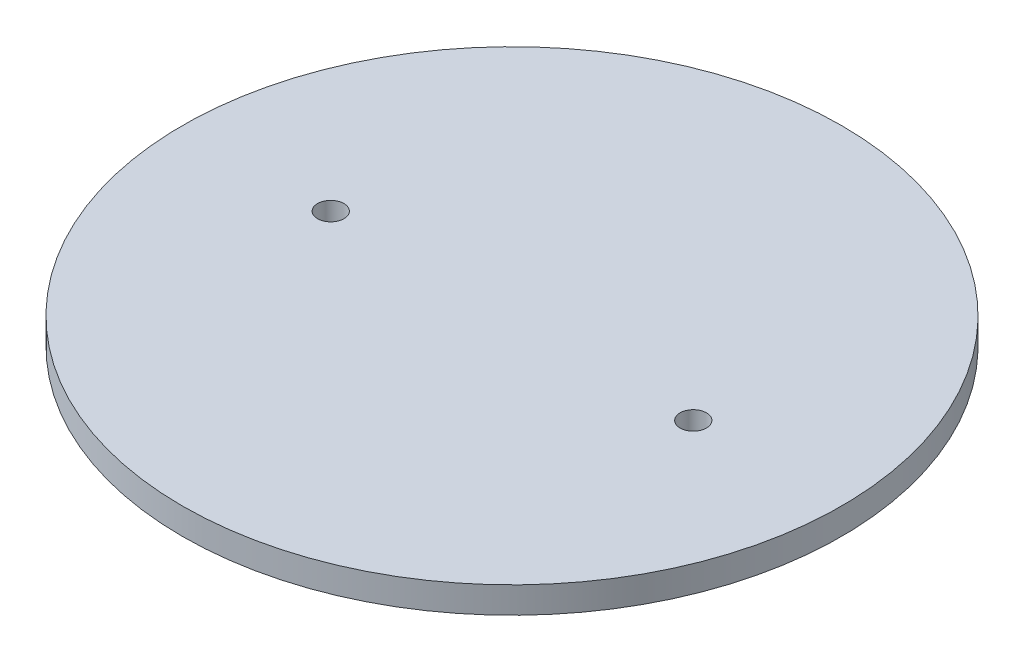
ISO-10303-21;
HEADER;
FILE_DESCRIPTION(('STEP AP214'),'2;1');
FILE_NAME('part.step','',(''),(''),'','','');
FILE_SCHEMA(('AUTOMOTIVE_DESIGN { 1 0 10303 214 1 1 1 1 }'));
ENDSEC;
DATA;
#1=APPLICATION_CONTEXT('core data for automotive mechanical design processes');
#2=APPLICATION_PROTOCOL_DEFINITION('international standard','automotive_design',2000,#1);
#3=PRODUCT_CONTEXT('',#1,'mechanical');
#4=PRODUCT('Part','Part','',(#3));
#5=PRODUCT_RELATED_PRODUCT_CATEGORY('part','',(#4));
#6=PRODUCT_DEFINITION_FORMATION('','',#4);
#7=PRODUCT_DEFINITION_CONTEXT('part definition',#1,'design');
#8=PRODUCT_DEFINITION('design','',#6,#7);
#9=PRODUCT_DEFINITION_SHAPE('','',#8);
#10=(LENGTH_UNIT() NAMED_UNIT(*) SI_UNIT(.MILLI.,.METRE.));
#11=(NAMED_UNIT(*) PLANE_ANGLE_UNIT() SI_UNIT($,.RADIAN.));
#12=(NAMED_UNIT(*) SI_UNIT($,.STERADIAN.) SOLID_ANGLE_UNIT());
#13=UNCERTAINTY_MEASURE_WITH_UNIT(LENGTH_MEASURE(1.E-05),#10,'distance_accuracy_value','');
#14=(GEOMETRIC_REPRESENTATION_CONTEXT(3) GLOBAL_UNCERTAINTY_ASSIGNED_CONTEXT((#13)) GLOBAL_UNIT_ASSIGNED_CONTEXT((#10,
#11,#12)) REPRESENTATION_CONTEXT('',''));
#15=CARTESIAN_POINT('',(0.,0.,0.));
#16=DIRECTION('',(0.,0.,1.));
#17=DIRECTION('',(1.,0.,0.));
#18=AXIS2_PLACEMENT_3D('',#15,#16,#17);
#19=CARTESIAN_POINT('',(0.,4.,0.));
#20=DIRECTION('',(0.,1.,0.));
#21=DIRECTION('',(0.,0.,1.));
#22=AXIS2_PLACEMENT_3D('',#19,#20,#21);
#23=PLANE('',#22);
#24=CARTESIAN_POINT('',(-27.5,4.,0.));
#25=DIRECTION('',(0.,1.,0.));
#26=DIRECTION('',(0.,0.,1.));
#27=AXIS2_PLACEMENT_3D('',#24,#25,#26);
#28=CIRCLE('',#27,2.);
#29=CARTESIAN_POINT('',(-27.5,4.,2.));
#30=VERTEX_POINT('',#29);
#31=EDGE_CURVE('E42',#30,#30,#28,.T.);
#32=ORIENTED_EDGE('',*,*,#31,.F.);
#33=EDGE_LOOP('',(#32));
#34=FACE_BOUND('',#33,.T.);
#35=CARTESIAN_POINT('',(0.,4.,0.));
#36=DIRECTION('',(0.,1.,0.));
#37=DIRECTION('',(0.,0.,1.));
#38=AXIS2_PLACEMENT_3D('',#35,#36,#37);
#39=CIRCLE('',#38,50.);
#40=CARTESIAN_POINT('',(0.,4.,50.));
#41=VERTEX_POINT('',#40);
#42=EDGE_CURVE('E10',#41,#41,#39,.T.);
#43=ORIENTED_EDGE('',*,*,#42,.T.);
#44=EDGE_LOOP('',(#43));
#45=FACE_BOUND('',#44,.T.);
#46=CARTESIAN_POINT('',(27.5,4.,0.));
#47=DIRECTION('',(0.,1.,0.));
#48=DIRECTION('',(0.,0.,1.));
#49=AXIS2_PLACEMENT_3D('',#46,#47,#48);
#50=CIRCLE('',#49,2.);
#51=CARTESIAN_POINT('',(27.5,4.,2.));
#52=VERTEX_POINT('',#51);
#53=EDGE_CURVE('E47',#52,#52,#50,.T.);
#54=ORIENTED_EDGE('',*,*,#53,.F.);
#55=EDGE_LOOP('',(#54));
#56=FACE_BOUND('',#55,.T.);
#57=ADVANCED_FACE('F31',(#34,#45,#56),#23,.T.);
#58=CARTESIAN_POINT('',(0.,0.,0.));
#59=DIRECTION('',(0.,1.,0.));
#60=DIRECTION('',(0.,0.,1.));
#61=AXIS2_PLACEMENT_3D('',#58,#59,#60);
#62=PLANE('',#61);
#63=CARTESIAN_POINT('',(0.,0.,0.));
#64=DIRECTION('',(0.,1.,0.));
#65=DIRECTION('',(0.,0.,1.));
#66=AXIS2_PLACEMENT_3D('',#63,#64,#65);
#67=CIRCLE('',#66,50.);
#68=CARTESIAN_POINT('',(0.,0.,50.));
#69=VERTEX_POINT('',#68);
#70=EDGE_CURVE('E35',#69,#69,#67,.T.);
#71=ORIENTED_EDGE('',*,*,#70,.F.);
#72=EDGE_LOOP('',(#71));
#73=FACE_BOUND('',#72,.T.);
#74=CARTESIAN_POINT('',(-27.5,0.,0.));
#75=DIRECTION('',(0.,1.,0.));
#76=DIRECTION('',(0.,0.,1.));
#77=AXIS2_PLACEMENT_3D('',#74,#75,#76);
#78=CIRCLE('',#77,2.);
#79=CARTESIAN_POINT('',(-27.5,0.,2.));
#80=VERTEX_POINT('',#79);
#81=EDGE_CURVE('E44',#80,#80,#78,.T.);
#82=ORIENTED_EDGE('',*,*,#81,.T.);
#83=EDGE_LOOP('',(#82));
#84=FACE_BOUND('',#83,.T.);
#85=CARTESIAN_POINT('',(27.5,0.,0.));
#86=DIRECTION('',(0.,1.,0.));
#87=DIRECTION('',(0.,0.,1.));
#88=AXIS2_PLACEMENT_3D('',#85,#86,#87);
#89=CIRCLE('',#88,2.);
#90=CARTESIAN_POINT('',(27.5,0.,2.));
#91=VERTEX_POINT('',#90);
#92=EDGE_CURVE('E50',#91,#91,#89,.T.);
#93=ORIENTED_EDGE('',*,*,#92,.T.);
#94=EDGE_LOOP('',(#93));
#95=FACE_BOUND('',#94,.T.);
#96=ADVANCED_FACE('F60',(#73,#84,#95),#62,.F.);
#97=CARTESIAN_POINT('',(0.,4.,0.));
#98=DIRECTION('',(0.,-1.,0.));
#99=DIRECTION('',(0.,0.,-1.));
#100=AXIS2_PLACEMENT_3D('',#97,#98,#99);
#101=CYLINDRICAL_SURFACE('',#100,50.);
#102=ORIENTED_EDGE('',*,*,#42,.F.);
#103=EDGE_LOOP('',(#102));
#104=FACE_BOUND('',#103,.T.);
#105=ORIENTED_EDGE('',*,*,#70,.T.);
#106=EDGE_LOOP('',(#105));
#107=FACE_BOUND('',#106,.T.);
#108=ADVANCED_FACE('F33',(#104,#107),#101,.T.);
#109=CARTESIAN_POINT('',(-27.5,4.,0.));
#110=DIRECTION('',(0.,-1.,0.));
#111=DIRECTION('',(0.,0.,-1.));
#112=AXIS2_PLACEMENT_3D('',#109,#110,#111);
#113=CYLINDRICAL_SURFACE('',#112,2.);
#114=ORIENTED_EDGE('',*,*,#31,.T.);
#115=EDGE_LOOP('',(#114));
#116=FACE_BOUND('',#115,.T.);
#117=ORIENTED_EDGE('',*,*,#81,.F.);
#118=EDGE_LOOP('',(#117));
#119=FACE_BOUND('',#118,.T.);
#120=ADVANCED_FACE('F69',(#116,#119),#113,.F.);
#121=CARTESIAN_POINT('',(27.5,4.,0.));
#122=DIRECTION('',(0.,-1.,0.));
#123=DIRECTION('',(0.,0.,-1.));
#124=AXIS2_PLACEMENT_3D('',#121,#122,#123);
#125=CYLINDRICAL_SURFACE('',#124,2.);
#126=ORIENTED_EDGE('',*,*,#53,.T.);
#127=EDGE_LOOP('',(#126));
#128=FACE_BOUND('',#127,.T.);
#129=ORIENTED_EDGE('',*,*,#92,.F.);
#130=EDGE_LOOP('',(#129));
#131=FACE_BOUND('',#130,.T.);
#132=ADVANCED_FACE('F56',(#128,#131),#125,.F.);
#133=CLOSED_SHELL('',(#57,#96,#108,#120,#132));
#134=MANIFOLD_SOLID_BREP('B2',#133);
#135=ADVANCED_BREP_SHAPE_REPRESENTATION('',(#18,#134),#14);
#136=SHAPE_DEFINITION_REPRESENTATION(#9,#135);
ENDSEC;
END-ISO-10303-21;
